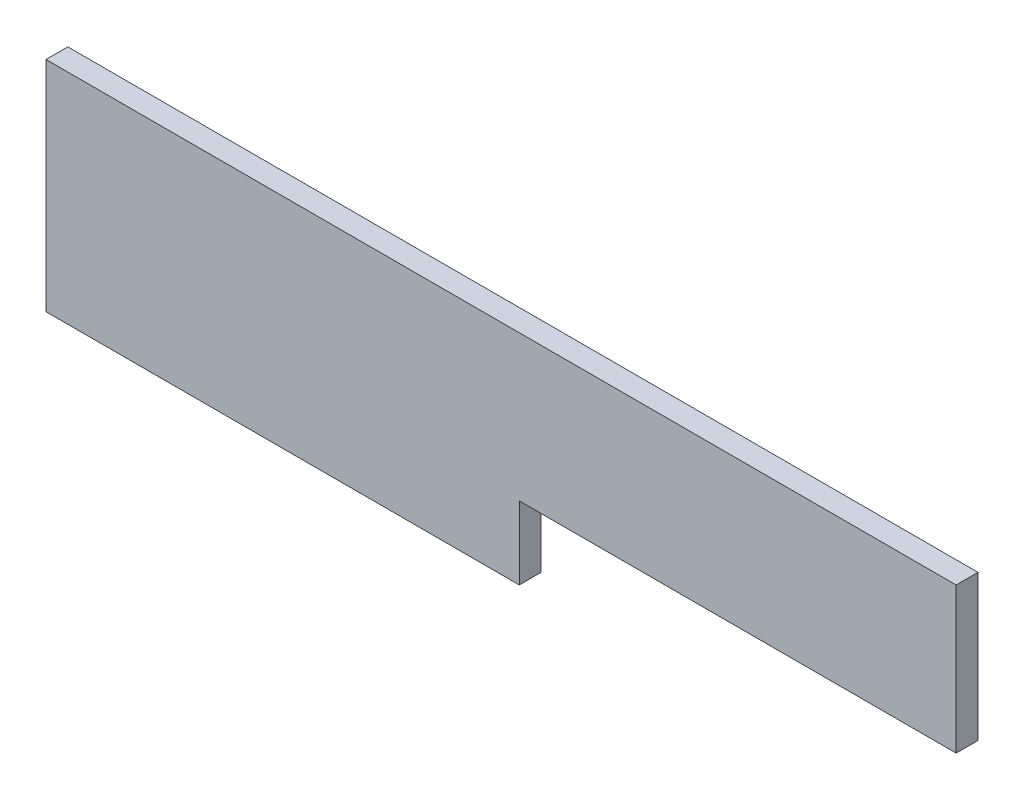
ISO-10303-21;
HEADER;
FILE_DESCRIPTION(('STEP AP214'),'2;1');
FILE_NAME('part.step','',(''),(''),'','','');
FILE_SCHEMA(('AUTOMOTIVE_DESIGN { 1 0 10303 214 1 1 1 1 }'));
ENDSEC;
DATA;
#1=APPLICATION_CONTEXT('core data for automotive mechanical design processes');
#2=APPLICATION_PROTOCOL_DEFINITION('international standard','automotive_design',2000,#1);
#3=PRODUCT_CONTEXT('',#1,'mechanical');
#4=PRODUCT('Part','Part','',(#3));
#5=PRODUCT_RELATED_PRODUCT_CATEGORY('part','',(#4));
#6=PRODUCT_DEFINITION_FORMATION('','',#4);
#7=PRODUCT_DEFINITION_CONTEXT('part definition',#1,'design');
#8=PRODUCT_DEFINITION('design','',#6,#7);
#9=PRODUCT_DEFINITION_SHAPE('','',#8);
#10=(LENGTH_UNIT() NAMED_UNIT(*) SI_UNIT(.MILLI.,.METRE.));
#11=(NAMED_UNIT(*) PLANE_ANGLE_UNIT() SI_UNIT($,.RADIAN.));
#12=(NAMED_UNIT(*) SI_UNIT($,.STERADIAN.) SOLID_ANGLE_UNIT());
#13=UNCERTAINTY_MEASURE_WITH_UNIT(LENGTH_MEASURE(1.E-05),#10,'distance_accuracy_value','');
#14=(GEOMETRIC_REPRESENTATION_CONTEXT(3) GLOBAL_UNCERTAINTY_ASSIGNED_CONTEXT((#13)) GLOBAL_UNIT_ASSIGNED_CONTEXT((#10,
#11,#12)) REPRESENTATION_CONTEXT('',''));
#15=CARTESIAN_POINT('',(0.,0.,0.));
#16=DIRECTION('',(0.,0.,1.));
#17=DIRECTION('',(1.,0.,0.));
#18=AXIS2_PLACEMENT_3D('',#15,#16,#17);
#19=CARTESIAN_POINT('',(65.,0.,-6.));
#20=DIRECTION('',(0.,-1.,0.));
#21=DIRECTION('',(0.,0.,-1.));
#22=AXIS2_PLACEMENT_3D('',#19,#20,#21);
#23=PLANE('',#22);
#24=DIRECTION('',(1.,0.,0.));
#25=VECTOR('',#24,1.);
#26=CARTESIAN_POINT('',(65.,0.,0.));
#27=LINE('',#26,#25);
#28=CARTESIAN_POINT('',(-65.,0.,0.));
#29=VERTEX_POINT('',#28);
#30=CARTESIAN_POINT('',(65.,0.,0.));
#31=VERTEX_POINT('',#30);
#32=EDGE_CURVE('E120',#29,#31,#27,.T.);
#33=ORIENTED_EDGE('',*,*,#32,.F.);
#34=DIRECTION('',(0.,0.,1.));
#35=VECTOR('',#34,1.);
#36=CARTESIAN_POINT('',(-65.,0.,-6.));
#37=LINE('',#36,#35);
#38=CARTESIAN_POINT('',(-65.,0.,-6.));
#39=VERTEX_POINT('',#38);
#40=EDGE_CURVE('E11',#39,#29,#37,.T.);
#41=ORIENTED_EDGE('',*,*,#40,.F.);
#42=DIRECTION('',(1.,0.,0.));
#43=VECTOR('',#42,1.);
#44=CARTESIAN_POINT('',(65.,0.,-6.));
#45=LINE('',#44,#43);
#46=CARTESIAN_POINT('',(65.,0.,-6.));
#47=VERTEX_POINT('',#46);
#48=EDGE_CURVE('E134',#39,#47,#45,.T.);
#49=ORIENTED_EDGE('',*,*,#48,.T.);
#50=DIRECTION('',(0.,0.,1.));
#51=VECTOR('',#50,1.);
#52=CARTESIAN_POINT('',(65.,0.,-6.));
#53=LINE('',#52,#51);
#54=EDGE_CURVE('E38',#47,#31,#53,.T.);
#55=ORIENTED_EDGE('',*,*,#54,.T.);
#56=EDGE_LOOP('',(#33,#41,#49,#55));
#57=FACE_BOUND('',#56,.T.);
#58=ADVANCED_FACE('F35',(#57),#23,.T.);
#59=CARTESIAN_POINT('',(-65.,0.,-6.));
#60=DIRECTION('',(-1.,0.,0.));
#61=DIRECTION('',(0.,0.,1.));
#62=AXIS2_PLACEMENT_3D('',#59,#60,#61);
#63=PLANE('',#62);
#64=DIRECTION('',(0.,-1.,0.));
#65=VECTOR('',#64,1.);
#66=CARTESIAN_POINT('',(-65.,0.,0.));
#67=LINE('',#66,#65);
#68=CARTESIAN_POINT('',(-65.,60.,0.));
#69=VERTEX_POINT('',#68);
#70=EDGE_CURVE('E132',#69,#29,#67,.T.);
#71=ORIENTED_EDGE('',*,*,#70,.F.);
#72=DIRECTION('',(0.,0.,1.));
#73=VECTOR('',#72,1.);
#74=CARTESIAN_POINT('',(-65.,60.,-6.));
#75=LINE('',#74,#73);
#76=CARTESIAN_POINT('',(-65.,60.,-6.));
#77=VERTEX_POINT('',#76);
#78=EDGE_CURVE('E44',#77,#69,#75,.T.);
#79=ORIENTED_EDGE('',*,*,#78,.F.);
#80=DIRECTION('',(0.,-1.,0.));
#81=VECTOR('',#80,1.);
#82=CARTESIAN_POINT('',(-65.,0.,-6.));
#83=LINE('',#82,#81);
#84=EDGE_CURVE('E110',#77,#39,#83,.T.);
#85=ORIENTED_EDGE('',*,*,#84,.T.);
#86=ORIENTED_EDGE('',*,*,#40,.T.);
#87=EDGE_LOOP('',(#71,#79,#85,#86));
#88=FACE_BOUND('',#87,.T.);
#89=ADVANCED_FACE('F142',(#88),#63,.T.);
#90=CARTESIAN_POINT('',(-65.,60.,-6.));
#91=DIRECTION('',(0.,1.,0.));
#92=DIRECTION('',(0.,0.,1.));
#93=AXIS2_PLACEMENT_3D('',#90,#91,#92);
#94=PLANE('',#93);
#95=DIRECTION('',(-1.,0.,0.));
#96=VECTOR('',#95,1.);
#97=CARTESIAN_POINT('',(-65.,60.,0.));
#98=LINE('',#97,#96);
#99=CARTESIAN_POINT('',(185.,60.,0.));
#100=VERTEX_POINT('',#99);
#101=EDGE_CURVE('E97',#100,#69,#98,.T.);
#102=ORIENTED_EDGE('',*,*,#101,.F.);
#103=DIRECTION('',(0.,0.,1.));
#104=VECTOR('',#103,1.);
#105=CARTESIAN_POINT('',(185.,60.,-6.));
#106=LINE('',#105,#104);
#107=CARTESIAN_POINT('',(185.,60.,-6.));
#108=VERTEX_POINT('',#107);
#109=EDGE_CURVE('E92',#108,#100,#106,.T.);
#110=ORIENTED_EDGE('',*,*,#109,.F.);
#111=DIRECTION('',(-1.,0.,0.));
#112=VECTOR('',#111,1.);
#113=CARTESIAN_POINT('',(-65.,60.,-6.));
#114=LINE('',#113,#112);
#115=EDGE_CURVE('E95',#108,#77,#114,.T.);
#116=ORIENTED_EDGE('',*,*,#115,.T.);
#117=ORIENTED_EDGE('',*,*,#78,.T.);
#118=EDGE_LOOP('',(#102,#110,#116,#117));
#119=FACE_BOUND('',#118,.T.);
#120=ADVANCED_FACE('F94',(#119),#94,.T.);
#121=CARTESIAN_POINT('',(185.,60.,-6.));
#122=DIRECTION('',(1.,0.,0.));
#123=DIRECTION('',(0.,0.,-1.));
#124=AXIS2_PLACEMENT_3D('',#121,#122,#123);
#125=PLANE('',#124);
#126=DIRECTION('',(0.,1.,0.));
#127=VECTOR('',#126,1.);
#128=CARTESIAN_POINT('',(185.,60.,0.));
#129=LINE('',#128,#127);
#130=CARTESIAN_POINT('',(185.,20.,0.));
#131=VERTEX_POINT('',#130);
#132=EDGE_CURVE('E129',#131,#100,#129,.T.);
#133=ORIENTED_EDGE('',*,*,#132,.F.);
#134=DIRECTION('',(0.,0.,1.));
#135=VECTOR('',#134,1.);
#136=CARTESIAN_POINT('',(185.,20.,-6.));
#137=LINE('',#136,#135);
#138=CARTESIAN_POINT('',(185.,20.,-6.));
#139=VERTEX_POINT('',#138);
#140=EDGE_CURVE('E102',#139,#131,#137,.T.);
#141=ORIENTED_EDGE('',*,*,#140,.F.);
#142=DIRECTION('',(0.,1.,0.));
#143=VECTOR('',#142,1.);
#144=CARTESIAN_POINT('',(185.,60.,-6.));
#145=LINE('',#144,#143);
#146=EDGE_CURVE('E108',#139,#108,#145,.T.);
#147=ORIENTED_EDGE('',*,*,#146,.T.);
#148=ORIENTED_EDGE('',*,*,#109,.T.);
#149=EDGE_LOOP('',(#133,#141,#147,#148));
#150=FACE_BOUND('',#149,.T.);
#151=ADVANCED_FACE('F112',(#150),#125,.T.);
#152=CARTESIAN_POINT('',(185.,20.,-6.));
#153=DIRECTION('',(0.,-1.,0.));
#154=DIRECTION('',(1.,0.,0.));
#155=AXIS2_PLACEMENT_3D('',#152,#153,#154);
#156=PLANE('',#155);
#157=DIRECTION('',(1.,0.,0.));
#158=VECTOR('',#157,1.);
#159=CARTESIAN_POINT('',(185.,20.,0.));
#160=LINE('',#159,#158);
#161=CARTESIAN_POINT('',(65.,20.,0.));
#162=VERTEX_POINT('',#161);
#163=EDGE_CURVE('E126',#162,#131,#160,.T.);
#164=ORIENTED_EDGE('',*,*,#163,.F.);
#165=DIRECTION('',(0.,0.,1.));
#166=VECTOR('',#165,1.);
#167=CARTESIAN_POINT('',(65.,20.,-6.));
#168=LINE('',#167,#166);
#169=CARTESIAN_POINT('',(65.,20.,-6.));
#170=VERTEX_POINT('',#169);
#171=EDGE_CURVE('E137',#170,#162,#168,.T.);
#172=ORIENTED_EDGE('',*,*,#171,.F.);
#173=DIRECTION('',(1.,0.,0.));
#174=VECTOR('',#173,1.);
#175=CARTESIAN_POINT('',(185.,20.,-6.));
#176=LINE('',#175,#174);
#177=EDGE_CURVE('E113',#170,#139,#176,.T.);
#178=ORIENTED_EDGE('',*,*,#177,.T.);
#179=ORIENTED_EDGE('',*,*,#140,.T.);
#180=EDGE_LOOP('',(#164,#172,#178,#179));
#181=FACE_BOUND('',#180,.T.);
#182=ADVANCED_FACE('F155',(#181),#156,.T.);
#183=CARTESIAN_POINT('',(65.,20.,-6.));
#184=DIRECTION('',(1.,0.,0.));
#185=DIRECTION('',(0.,0.,-1.));
#186=AXIS2_PLACEMENT_3D('',#183,#184,#185);
#187=PLANE('',#186);
#188=DIRECTION('',(0.,1.,0.));
#189=VECTOR('',#188,1.);
#190=CARTESIAN_POINT('',(65.,20.,0.));
#191=LINE('',#190,#189);
#192=EDGE_CURVE('E123',#31,#162,#191,.T.);
#193=ORIENTED_EDGE('',*,*,#192,.F.);
#194=ORIENTED_EDGE('',*,*,#54,.F.);
#195=DIRECTION('',(0.,1.,0.));
#196=VECTOR('',#195,1.);
#197=CARTESIAN_POINT('',(65.,20.,-6.));
#198=LINE('',#197,#196);
#199=EDGE_CURVE('E115',#47,#170,#198,.T.);
#200=ORIENTED_EDGE('',*,*,#199,.T.);
#201=ORIENTED_EDGE('',*,*,#171,.T.);
#202=EDGE_LOOP('',(#193,#194,#200,#201));
#203=FACE_BOUND('',#202,.T.);
#204=ADVANCED_FACE('F139',(#203),#187,.T.);
#205=CARTESIAN_POINT('',(0.,0.,-6.));
#206=DIRECTION('',(0.,0.,-1.));
#207=DIRECTION('',(-1.,0.,0.));
#208=AXIS2_PLACEMENT_3D('',#205,#206,#207);
#209=PLANE('',#208);
#210=ORIENTED_EDGE('',*,*,#48,.F.);
#211=ORIENTED_EDGE('',*,*,#84,.F.);
#212=ORIENTED_EDGE('',*,*,#115,.F.);
#213=ORIENTED_EDGE('',*,*,#146,.F.);
#214=ORIENTED_EDGE('',*,*,#177,.F.);
#215=ORIENTED_EDGE('',*,*,#199,.F.);
#216=EDGE_LOOP('',(#210,#211,#212,#213,#214,#215));
#217=FACE_BOUND('',#216,.T.);
#218=ADVANCED_FACE('F106',(#217),#209,.T.);
#219=CARTESIAN_POINT('',(0.,0.,0.));
#220=DIRECTION('',(0.,0.,-1.));
#221=DIRECTION('',(-1.,0.,0.));
#222=AXIS2_PLACEMENT_3D('',#219,#220,#221);
#223=PLANE('',#222);
#224=ORIENTED_EDGE('',*,*,#32,.T.);
#225=ORIENTED_EDGE('',*,*,#192,.T.);
#226=ORIENTED_EDGE('',*,*,#163,.T.);
#227=ORIENTED_EDGE('',*,*,#132,.T.);
#228=ORIENTED_EDGE('',*,*,#101,.T.);
#229=ORIENTED_EDGE('',*,*,#70,.T.);
#230=EDGE_LOOP('',(#224,#225,#226,#227,#228,#229));
#231=FACE_BOUND('',#230,.T.);
#232=ADVANCED_FACE('F141',(#231),#223,.F.);
#233=CLOSED_SHELL('',(#58,#89,#120,#151,#182,#204,#218,#232));
#234=MANIFOLD_SOLID_BREP('B2',#233);
#235=ADVANCED_BREP_SHAPE_REPRESENTATION('',(#18,#234),#14);
#236=SHAPE_DEFINITION_REPRESENTATION(#9,#235);
ENDSEC;
END-ISO-10303-21;
